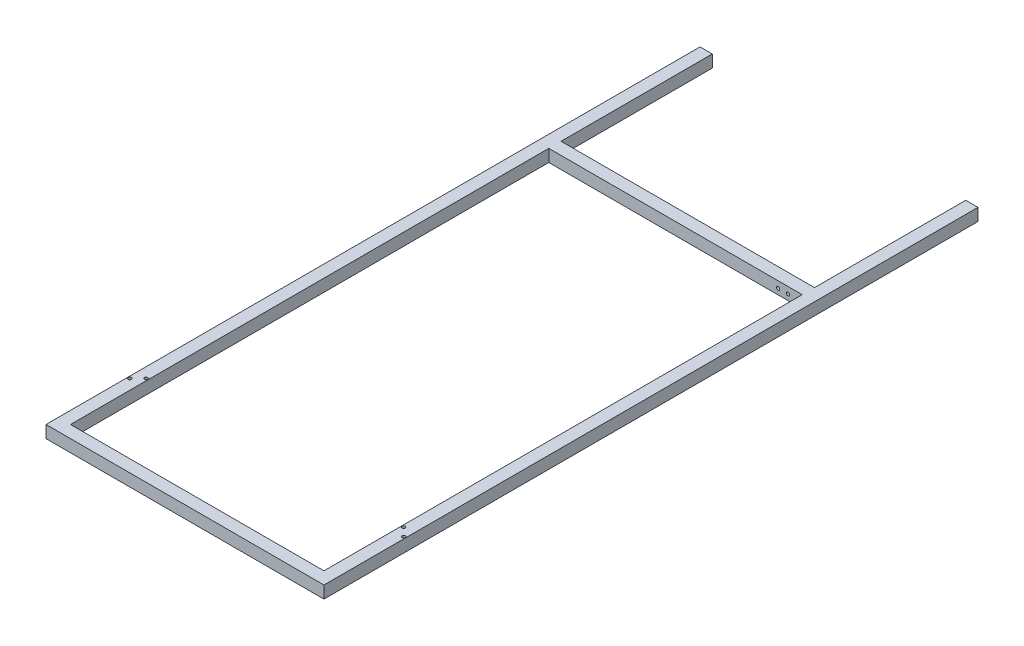
ISO-10303-21;
HEADER;
FILE_DESCRIPTION(('STEP AP214'),'2;1');
FILE_NAME('part.step','',(''),(''),'','','');
FILE_SCHEMA(('AUTOMOTIVE_DESIGN { 1 0 10303 214 1 1 1 1 }'));
ENDSEC;
DATA;
#1=APPLICATION_CONTEXT('core data for automotive mechanical design processes');
#2=APPLICATION_PROTOCOL_DEFINITION('international standard','automotive_design',2000,#1);
#3=PRODUCT_CONTEXT('',#1,'mechanical');
#4=PRODUCT('Part','Part','',(#3));
#5=PRODUCT_RELATED_PRODUCT_CATEGORY('part','',(#4));
#6=PRODUCT_DEFINITION_FORMATION('','',#4);
#7=PRODUCT_DEFINITION_CONTEXT('part definition',#1,'design');
#8=PRODUCT_DEFINITION('design','',#6,#7);
#9=PRODUCT_DEFINITION_SHAPE('','',#8);
#10=(LENGTH_UNIT() NAMED_UNIT(*) SI_UNIT(.MILLI.,.METRE.));
#11=(NAMED_UNIT(*) PLANE_ANGLE_UNIT() SI_UNIT($,.RADIAN.));
#12=(NAMED_UNIT(*) SI_UNIT($,.STERADIAN.) SOLID_ANGLE_UNIT());
#13=UNCERTAINTY_MEASURE_WITH_UNIT(LENGTH_MEASURE(1.E-05),#10,'distance_accuracy_value','');
#14=(GEOMETRIC_REPRESENTATION_CONTEXT(3) GLOBAL_UNCERTAINTY_ASSIGNED_CONTEXT((#13)) GLOBAL_UNIT_ASSIGNED_CONTEXT((#10,
#11,#12)) REPRESENTATION_CONTEXT('',''));
#15=CARTESIAN_POINT('',(0.,0.,0.));
#16=DIRECTION('',(0.,0.,1.));
#17=DIRECTION('',(1.,0.,0.));
#18=AXIS2_PLACEMENT_3D('',#15,#16,#17);
#19=CARTESIAN_POINT('',(157.642487046632,0.,785.));
#20=DIRECTION('',(1.,0.,0.));
#21=DIRECTION('',(0.,0.,-1.));
#22=AXIS2_PLACEMENT_3D('',#19,#20,#21);
#23=PLANE('',#22);
#24=DIRECTION('',(0.,0.,-1.));
#25=VECTOR('',#24,1.);
#26=CARTESIAN_POINT('',(157.642487046632,0.,785.));
#27=LINE('',#26,#25);
#28=CARTESIAN_POINT('',(157.642487046632,0.,185.));
#29=VERTEX_POINT('',#28);
#30=CARTESIAN_POINT('',(157.642487046632,0.,0.));
#31=VERTEX_POINT('',#30);
#32=EDGE_CURVE('E55',#29,#31,#27,.T.);
#33=ORIENTED_EDGE('',*,*,#32,.F.);
#34=DIRECTION('',(0.,1.,0.));
#35=VECTOR('',#34,1.);
#36=CARTESIAN_POINT('',(157.642487046632,0.,185.));
#37=LINE('',#36,#35);
#38=CARTESIAN_POINT('',(157.642487046632,15.,185.));
#39=VERTEX_POINT('',#38);
#40=EDGE_CURVE('E175',#29,#39,#37,.T.);
#41=ORIENTED_EDGE('',*,*,#40,.T.);
#42=DIRECTION('',(0.,0.,-1.));
#43=VECTOR('',#42,1.);
#44=CARTESIAN_POINT('',(157.642487046632,15.,785.));
#45=LINE('',#44,#43);
#46=CARTESIAN_POINT('',(157.642487046632,15.,0.));
#47=VERTEX_POINT('',#46);
#48=EDGE_CURVE('E195',#39,#47,#45,.T.);
#49=ORIENTED_EDGE('',*,*,#48,.T.);
#50=DIRECTION('',(0.,1.,0.));
#51=VECTOR('',#50,1.);
#52=CARTESIAN_POINT('',(157.642487046632,0.,0.));
#53=LINE('',#52,#51);
#54=EDGE_CURVE('E199',#31,#47,#53,.T.);
#55=ORIENTED_EDGE('',*,*,#54,.F.);
#56=EDGE_LOOP('',(#33,#41,#49,#55));
#57=FACE_BOUND('',#56,.T.);
#58=ADVANCED_FACE('F39',(#57),#23,.F.);
#59=CARTESIAN_POINT('',(-152.357512953368,0.,0.));
#60=DIRECTION('',(-1.,0.,0.));
#61=DIRECTION('',(0.,0.,1.));
#62=AXIS2_PLACEMENT_3D('',#59,#60,#61);
#63=PLANE('',#62);
#64=DIRECTION('',(0.,0.,1.));
#65=VECTOR('',#64,1.);
#66=CARTESIAN_POINT('',(-152.357512953368,15.,0.));
#67=LINE('',#66,#65);
#68=CARTESIAN_POINT('',(-152.357512953368,15.,0.));
#69=VERTEX_POINT('',#68);
#70=CARTESIAN_POINT('',(-152.357512953368,15.,185.));
#71=VERTEX_POINT('',#70);
#72=EDGE_CURVE('E143',#69,#71,#67,.T.);
#73=ORIENTED_EDGE('',*,*,#72,.T.);
#74=DIRECTION('',(0.,1.,0.));
#75=VECTOR('',#74,1.);
#76=CARTESIAN_POINT('',(-152.357512953368,0.,185.));
#77=LINE('',#76,#75);
#78=CARTESIAN_POINT('',(-152.357512953368,0.,185.));
#79=VERTEX_POINT('',#78);
#80=EDGE_CURVE('E144',#79,#71,#77,.T.);
#81=ORIENTED_EDGE('',*,*,#80,.F.);
#82=DIRECTION('',(0.,0.,1.));
#83=VECTOR('',#82,1.);
#84=CARTESIAN_POINT('',(-152.357512953368,0.,0.));
#85=LINE('',#84,#83);
#86=CARTESIAN_POINT('',(-152.357512953368,0.,0.));
#87=VERTEX_POINT('',#86);
#88=EDGE_CURVE('E180',#87,#79,#85,.T.);
#89=ORIENTED_EDGE('',*,*,#88,.F.);
#90=DIRECTION('',(0.,1.,0.));
#91=VECTOR('',#90,1.);
#92=CARTESIAN_POINT('',(-152.357512953368,0.,0.));
#93=LINE('',#92,#91);
#94=EDGE_CURVE('E190',#87,#69,#93,.T.);
#95=ORIENTED_EDGE('',*,*,#94,.T.);
#96=EDGE_LOOP('',(#73,#81,#89,#95));
#97=FACE_BOUND('',#96,.T.);
#98=ADVANCED_FACE('F365',(#97),#63,.F.);
#99=CARTESIAN_POINT('',(-167.357512953368,15.,0.));
#100=DIRECTION('',(0.,0.,1.));
#101=DIRECTION('',(1.,0.,0.));
#102=AXIS2_PLACEMENT_3D('',#99,#100,#101);
#103=PLANE('',#102);
#104=DIRECTION('',(-1.,0.,0.));
#105=VECTOR('',#104,1.);
#106=CARTESIAN_POINT('',(-167.357512953368,0.,0.));
#107=LINE('',#106,#105);
#108=CARTESIAN_POINT('',(172.642487046632,0.,0.));
#109=VERTEX_POINT('',#108);
#110=EDGE_CURVE('E217',#109,#31,#107,.T.);
#111=ORIENTED_EDGE('',*,*,#110,.T.);
#112=ORIENTED_EDGE('',*,*,#54,.T.);
#113=DIRECTION('',(-1.,0.,0.));
#114=VECTOR('',#113,1.);
#115=CARTESIAN_POINT('',(-167.357512953368,15.,0.));
#116=LINE('',#115,#114);
#117=CARTESIAN_POINT('',(172.642487046632,15.,0.));
#118=VERTEX_POINT('',#117);
#119=EDGE_CURVE('E224',#118,#47,#116,.T.);
#120=ORIENTED_EDGE('',*,*,#119,.F.);
#121=DIRECTION('',(0.,-1.,0.));
#122=VECTOR('',#121,1.);
#123=CARTESIAN_POINT('',(172.642487046632,15.,0.));
#124=LINE('',#123,#122);
#125=EDGE_CURVE('E245',#118,#109,#124,.T.);
#126=ORIENTED_EDGE('',*,*,#125,.T.);
#127=EDGE_LOOP('',(#111,#112,#120,#126));
#128=FACE_BOUND('',#127,.T.);
#129=ADVANCED_FACE('F264',(#128),#103,.F.);
#130=CARTESIAN_POINT('',(-167.357512953368,15.,0.));
#131=DIRECTION('',(1.,0.,0.));
#132=DIRECTION('',(0.,0.,-1.));
#133=AXIS2_PLACEMENT_3D('',#130,#131,#132);
#134=PLANE('',#133);
#135=DIRECTION('',(0.,0.,1.));
#136=VECTOR('',#135,1.);
#137=CARTESIAN_POINT('',(-167.357512953368,0.,0.));
#138=LINE('',#137,#136);
#139=CARTESIAN_POINT('',(-167.357512953368,0.,0.));
#140=VERTEX_POINT('',#139);
#141=CARTESIAN_POINT('',(-167.357512953368,0.,800.));
#142=VERTEX_POINT('',#141);
#143=EDGE_CURVE('E203',#140,#142,#138,.T.);
#144=ORIENTED_EDGE('',*,*,#143,.T.);
#145=DIRECTION('',(0.,-1.,0.));
#146=VECTOR('',#145,1.);
#147=CARTESIAN_POINT('',(-167.357512953368,15.,800.));
#148=LINE('',#147,#146);
#149=CARTESIAN_POINT('',(-167.357512953368,15.,800.));
#150=VERTEX_POINT('',#149);
#151=EDGE_CURVE('E11',#150,#142,#148,.T.);
#152=ORIENTED_EDGE('',*,*,#151,.F.);
#153=DIRECTION('',(0.,0.,1.));
#154=VECTOR('',#153,1.);
#155=CARTESIAN_POINT('',(-167.357512953368,15.,0.));
#156=LINE('',#155,#154);
#157=CARTESIAN_POINT('',(-167.357512953368,15.,0.));
#158=VERTEX_POINT('',#157);
#159=EDGE_CURVE('E212',#158,#150,#156,.T.);
#160=ORIENTED_EDGE('',*,*,#159,.F.);
#161=DIRECTION('',(0.,-1.,0.));
#162=VECTOR('',#161,1.);
#163=CARTESIAN_POINT('',(-167.357512953368,15.,0.));
#164=LINE('',#163,#162);
#165=EDGE_CURVE('E228',#158,#140,#164,.T.);
#166=ORIENTED_EDGE('',*,*,#165,.T.);
#167=EDGE_LOOP('',(#144,#152,#160,#166));
#168=FACE_BOUND('',#167,.T.);
#169=ADVANCED_FACE('F41',(#168),#134,.F.);
#170=CARTESIAN_POINT('',(-167.357512953368,15.,800.));
#171=DIRECTION('',(0.,0.,-1.));
#172=DIRECTION('',(-1.,0.,0.));
#173=AXIS2_PLACEMENT_3D('',#170,#171,#172);
#174=PLANE('',#173);
#175=DIRECTION('',(1.,0.,0.));
#176=VECTOR('',#175,1.);
#177=CARTESIAN_POINT('',(-167.357512953368,0.,800.));
#178=LINE('',#177,#176);
#179=CARTESIAN_POINT('',(172.642487046632,0.,800.));
#180=VERTEX_POINT('',#179);
#181=EDGE_CURVE('E232',#142,#180,#178,.T.);
#182=ORIENTED_EDGE('',*,*,#181,.T.);
#183=DIRECTION('',(0.,-1.,0.));
#184=VECTOR('',#183,1.);
#185=CARTESIAN_POINT('',(172.642487046632,15.,800.));
#186=LINE('',#185,#184);
#187=CARTESIAN_POINT('',(172.642487046632,15.,800.));
#188=VERTEX_POINT('',#187);
#189=EDGE_CURVE('E48',#188,#180,#186,.T.);
#190=ORIENTED_EDGE('',*,*,#189,.F.);
#191=DIRECTION('',(1.,0.,0.));
#192=VECTOR('',#191,1.);
#193=CARTESIAN_POINT('',(-167.357512953368,15.,800.));
#194=LINE('',#193,#192);
#195=EDGE_CURVE('E216',#150,#188,#194,.T.);
#196=ORIENTED_EDGE('',*,*,#195,.F.);
#197=ORIENTED_EDGE('',*,*,#151,.T.);
#198=EDGE_LOOP('',(#182,#190,#196,#197));
#199=FACE_BOUND('',#198,.T.);
#200=ADVANCED_FACE('F269',(#199),#174,.F.);
#201=CARTESIAN_POINT('',(172.642487046632,15.,0.));
#202=DIRECTION('',(-1.,0.,0.));
#203=DIRECTION('',(0.,0.,1.));
#204=AXIS2_PLACEMENT_3D('',#201,#202,#203);
#205=PLANE('',#204);
#206=DIRECTION('',(0.,0.,-1.));
#207=VECTOR('',#206,1.);
#208=CARTESIAN_POINT('',(172.642487046632,0.,0.));
#209=LINE('',#208,#207);
#210=EDGE_CURVE('E235',#180,#109,#209,.T.);
#211=ORIENTED_EDGE('',*,*,#210,.T.);
#212=ORIENTED_EDGE('',*,*,#125,.F.);
#213=DIRECTION('',(0.,0.,-1.));
#214=VECTOR('',#213,1.);
#215=CARTESIAN_POINT('',(172.642487046632,15.,0.));
#216=LINE('',#215,#214);
#217=EDGE_CURVE('E220',#188,#118,#216,.T.);
#218=ORIENTED_EDGE('',*,*,#217,.F.);
#219=ORIENTED_EDGE('',*,*,#189,.T.);
#220=EDGE_LOOP('',(#211,#212,#218,#219));
#221=FACE_BOUND('',#220,.T.);
#222=ADVANCED_FACE('F254',(#221),#205,.F.);
#223=EDGE_CURVE('E223',#69,#158,#116,.T.);
#224=ORIENTED_EDGE('',*,*,#223,.F.);
#225=ORIENTED_EDGE('',*,*,#94,.F.);
#226=EDGE_CURVE('E238',#87,#140,#107,.T.);
#227=ORIENTED_EDGE('',*,*,#226,.T.);
#228=ORIENTED_EDGE('',*,*,#165,.F.);
#229=EDGE_LOOP('',(#224,#225,#227,#228));
#230=FACE_BOUND('',#229,.T.);
#231=ADVANCED_FACE('F347',(#230),#103,.F.);
#232=CARTESIAN_POINT('',(0.,15.,0.));
#233=DIRECTION('',(0.,1.,0.));
#234=DIRECTION('',(0.,0.,1.));
#235=AXIS2_PLACEMENT_3D('',#232,#233,#234);
#236=PLANE('',#235);
#237=CARTESIAN_POINT('',(-154.857512953368,15.,690.));
#238=DIRECTION('',(0.,1.,0.));
#239=DIRECTION('',(0.,0.,1.));
#240=AXIS2_PLACEMENT_3D('',#237,#238,#239);
#241=CIRCLE('',#240,2.);
#242=CARTESIAN_POINT('',(-154.857512953368,15.,692.));
#243=VERTEX_POINT('',#242);
#244=EDGE_CURVE('E311',#243,#243,#241,.T.);
#245=ORIENTED_EDGE('',*,*,#244,.F.);
#246=EDGE_LOOP('',(#245));
#247=FACE_BOUND('',#246,.T.);
#248=CARTESIAN_POINT('',(-164.857512953368,15.,700.));
#249=DIRECTION('',(0.,1.,0.));
#250=DIRECTION('',(0.,0.,1.));
#251=AXIS2_PLACEMENT_3D('',#248,#249,#250);
#252=CIRCLE('',#251,2.);
#253=CARTESIAN_POINT('',(-164.857512953368,15.,702.));
#254=VERTEX_POINT('',#253);
#255=EDGE_CURVE('E319',#254,#254,#252,.T.);
#256=ORIENTED_EDGE('',*,*,#255,.F.);
#257=EDGE_LOOP('',(#256));
#258=FACE_BOUND('',#257,.T.);
#259=CARTESIAN_POINT('',(170.142487046632,15.,700.));
#260=DIRECTION('',(0.,1.,0.));
#261=DIRECTION('',(0.,0.,1.));
#262=AXIS2_PLACEMENT_3D('',#259,#260,#261);
#263=CIRCLE('',#262,2.);
#264=CARTESIAN_POINT('',(170.142487046632,15.,702.));
#265=VERTEX_POINT('',#264);
#266=EDGE_CURVE('E327',#265,#265,#263,.T.);
#267=ORIENTED_EDGE('',*,*,#266,.F.);
#268=EDGE_LOOP('',(#267));
#269=FACE_BOUND('',#268,.T.);
#270=CARTESIAN_POINT('',(160.142487046632,15.,690.));
#271=DIRECTION('',(0.,1.,0.));
#272=DIRECTION('',(0.,0.,1.));
#273=AXIS2_PLACEMENT_3D('',#270,#271,#272);
#274=CIRCLE('',#273,2.);
#275=CARTESIAN_POINT('',(160.142487046632,15.,692.));
#276=VERTEX_POINT('',#275);
#277=EDGE_CURVE('E303',#276,#276,#274,.T.);
#278=ORIENTED_EDGE('',*,*,#277,.F.);
#279=EDGE_LOOP('',(#278));
#280=FACE_BOUND('',#279,.T.);
#281=ORIENTED_EDGE('',*,*,#48,.F.);
#282=DIRECTION('',(-1.,0.,0.));
#283=VECTOR('',#282,1.);
#284=CARTESIAN_POINT('',(-152.357512953368,15.,185.));
#285=LINE('',#284,#283);
#286=EDGE_CURVE('E158',#39,#71,#285,.T.);
#287=ORIENTED_EDGE('',*,*,#286,.T.);
#288=ORIENTED_EDGE('',*,*,#72,.F.);
#289=ORIENTED_EDGE('',*,*,#223,.T.);
#290=ORIENTED_EDGE('',*,*,#159,.T.);
#291=ORIENTED_EDGE('',*,*,#195,.T.);
#292=ORIENTED_EDGE('',*,*,#217,.T.);
#293=ORIENTED_EDGE('',*,*,#119,.T.);
#294=EDGE_LOOP('',(#281,#287,#288,#289,#290,#291,#292,#293));
#295=FACE_BOUND('',#294,.T.);
#296=CARTESIAN_POINT('',(157.642487046632,15.,785.));
#297=VERTEX_POINT('',#296);
#298=CARTESIAN_POINT('',(157.642487046632,15.,200.));
#299=VERTEX_POINT('',#298);
#300=EDGE_CURVE('E196',#297,#299,#45,.T.);
#301=ORIENTED_EDGE('',*,*,#300,.F.);
#302=DIRECTION('',(1.,0.,0.));
#303=VECTOR('',#302,1.);
#304=CARTESIAN_POINT('',(-152.357512953368,15.,785.));
#305=LINE('',#304,#303);
#306=CARTESIAN_POINT('',(-152.357512953368,15.,785.));
#307=VERTEX_POINT('',#306);
#308=EDGE_CURVE('E138',#307,#297,#305,.T.);
#309=ORIENTED_EDGE('',*,*,#308,.F.);
#310=CARTESIAN_POINT('',(-152.357512953368,15.,200.));
#311=VERTEX_POINT('',#310);
#312=EDGE_CURVE('E131',#311,#307,#67,.T.);
#313=ORIENTED_EDGE('',*,*,#312,.F.);
#314=DIRECTION('',(1.,0.,0.));
#315=VECTOR('',#314,1.);
#316=CARTESIAN_POINT('',(157.642487046632,15.,200.));
#317=LINE('',#316,#315);
#318=EDGE_CURVE('E136',#311,#299,#317,.T.);
#319=ORIENTED_EDGE('',*,*,#318,.T.);
#320=EDGE_LOOP('',(#301,#309,#313,#319));
#321=FACE_BOUND('',#320,.T.);
#322=ADVANCED_FACE('F134',(#247,#258,#269,#280,#295,#321),#236,.T.);
#323=CARTESIAN_POINT('',(0.,0.,0.));
#324=DIRECTION('',(0.,1.,0.));
#325=DIRECTION('',(0.,0.,1.));
#326=AXIS2_PLACEMENT_3D('',#323,#324,#325);
#327=PLANE('',#326);
#328=CARTESIAN_POINT('',(-154.857512953368,0.,690.));
#329=DIRECTION('',(0.,1.,0.));
#330=DIRECTION('',(0.,0.,1.));
#331=AXIS2_PLACEMENT_3D('',#328,#329,#330);
#332=CIRCLE('',#331,2.);
#333=CARTESIAN_POINT('',(-154.857512953368,0.,692.));
#334=VERTEX_POINT('',#333);
#335=EDGE_CURVE('E315',#334,#334,#332,.T.);
#336=ORIENTED_EDGE('',*,*,#335,.T.);
#337=EDGE_LOOP('',(#336));
#338=FACE_BOUND('',#337,.T.);
#339=CARTESIAN_POINT('',(-164.857512953368,0.,700.));
#340=DIRECTION('',(0.,1.,0.));
#341=DIRECTION('',(0.,0.,1.));
#342=AXIS2_PLACEMENT_3D('',#339,#340,#341);
#343=CIRCLE('',#342,2.);
#344=CARTESIAN_POINT('',(-164.857512953368,0.,702.));
#345=VERTEX_POINT('',#344);
#346=EDGE_CURVE('E323',#345,#345,#343,.T.);
#347=ORIENTED_EDGE('',*,*,#346,.T.);
#348=EDGE_LOOP('',(#347));
#349=FACE_BOUND('',#348,.T.);
#350=CARTESIAN_POINT('',(170.142487046632,0.,700.));
#351=DIRECTION('',(0.,1.,0.));
#352=DIRECTION('',(0.,0.,1.));
#353=AXIS2_PLACEMENT_3D('',#350,#351,#352);
#354=CIRCLE('',#353,2.);
#355=CARTESIAN_POINT('',(170.142487046632,0.,702.));
#356=VERTEX_POINT('',#355);
#357=EDGE_CURVE('E307',#356,#356,#354,.T.);
#358=ORIENTED_EDGE('',*,*,#357,.T.);
#359=EDGE_LOOP('',(#358));
#360=FACE_BOUND('',#359,.T.);
#361=CARTESIAN_POINT('',(160.142487046632,0.,690.));
#362=DIRECTION('',(0.,1.,0.));
#363=DIRECTION('',(0.,0.,1.));
#364=AXIS2_PLACEMENT_3D('',#361,#362,#363);
#365=CIRCLE('',#364,2.);
#366=CARTESIAN_POINT('',(160.142487046632,0.,692.));
#367=VERTEX_POINT('',#366);
#368=EDGE_CURVE('E288',#367,#367,#365,.T.);
#369=ORIENTED_EDGE('',*,*,#368,.T.);
#370=EDGE_LOOP('',(#369));
#371=FACE_BOUND('',#370,.T.);
#372=DIRECTION('',(-1.,0.,0.));
#373=VECTOR('',#372,1.);
#374=CARTESIAN_POINT('',(-152.357512953368,0.,185.));
#375=LINE('',#374,#373);
#376=EDGE_CURVE('E154',#29,#79,#375,.T.);
#377=ORIENTED_EDGE('',*,*,#376,.F.);
#378=ORIENTED_EDGE('',*,*,#32,.T.);
#379=ORIENTED_EDGE('',*,*,#110,.F.);
#380=ORIENTED_EDGE('',*,*,#210,.F.);
#381=ORIENTED_EDGE('',*,*,#181,.F.);
#382=ORIENTED_EDGE('',*,*,#143,.F.);
#383=ORIENTED_EDGE('',*,*,#226,.F.);
#384=ORIENTED_EDGE('',*,*,#88,.T.);
#385=EDGE_LOOP('',(#377,#378,#379,#380,#381,#382,#383,#384));
#386=FACE_BOUND('',#385,.T.);
#387=DIRECTION('',(1.,0.,0.));
#388=VECTOR('',#387,1.);
#389=CARTESIAN_POINT('',(-152.357512953368,0.,785.));
#390=LINE('',#389,#388);
#391=CARTESIAN_POINT('',(-152.357512953368,0.,785.));
#392=VERTEX_POINT('',#391);
#393=CARTESIAN_POINT('',(157.642487046632,0.,785.));
#394=VERTEX_POINT('',#393);
#395=EDGE_CURVE('E184',#392,#394,#390,.T.);
#396=ORIENTED_EDGE('',*,*,#395,.T.);
#397=CARTESIAN_POINT('',(157.642487046632,0.,200.));
#398=VERTEX_POINT('',#397);
#399=EDGE_CURVE('E188',#394,#398,#27,.T.);
#400=ORIENTED_EDGE('',*,*,#399,.T.);
#401=DIRECTION('',(1.,0.,0.));
#402=VECTOR('',#401,1.);
#403=CARTESIAN_POINT('',(157.642487046632,0.,200.));
#404=LINE('',#403,#402);
#405=CARTESIAN_POINT('',(-152.357512953368,0.,200.));
#406=VERTEX_POINT('',#405);
#407=EDGE_CURVE('E164',#406,#398,#404,.T.);
#408=ORIENTED_EDGE('',*,*,#407,.F.);
#409=EDGE_CURVE('E149',#406,#392,#85,.T.);
#410=ORIENTED_EDGE('',*,*,#409,.T.);
#411=EDGE_LOOP('',(#396,#400,#408,#410));
#412=FACE_BOUND('',#411,.T.);
#413=ADVANCED_FACE('F260',(#338,#349,#360,#371,#386,#412),#327,.F.);
#414=ORIENTED_EDGE('',*,*,#300,.T.);
#415=DIRECTION('',(0.,1.,0.));
#416=VECTOR('',#415,1.);
#417=CARTESIAN_POINT('',(157.642487046632,0.,200.));
#418=LINE('',#417,#416);
#419=EDGE_CURVE('E63',#398,#299,#418,.T.);
#420=ORIENTED_EDGE('',*,*,#419,.F.);
#421=ORIENTED_EDGE('',*,*,#399,.F.);
#422=DIRECTION('',(0.,1.,0.));
#423=VECTOR('',#422,1.);
#424=CARTESIAN_POINT('',(157.642487046632,0.,785.));
#425=LINE('',#424,#423);
#426=EDGE_CURVE('E204',#394,#297,#425,.T.);
#427=ORIENTED_EDGE('',*,*,#426,.T.);
#428=EDGE_LOOP('',(#414,#420,#421,#427));
#429=FACE_BOUND('',#428,.T.);
#430=ADVANCED_FACE('F367',(#429),#23,.F.);
#431=CARTESIAN_POINT('',(-152.357512953368,0.,785.));
#432=DIRECTION('',(0.,0.,1.));
#433=DIRECTION('',(1.,0.,0.));
#434=AXIS2_PLACEMENT_3D('',#431,#432,#433);
#435=PLANE('',#434);
#436=ORIENTED_EDGE('',*,*,#308,.T.);
#437=ORIENTED_EDGE('',*,*,#426,.F.);
#438=ORIENTED_EDGE('',*,*,#395,.F.);
#439=DIRECTION('',(0.,1.,0.));
#440=VECTOR('',#439,1.);
#441=CARTESIAN_POINT('',(-152.357512953368,0.,785.));
#442=LINE('',#441,#440);
#443=EDGE_CURVE('E207',#392,#307,#442,.T.);
#444=ORIENTED_EDGE('',*,*,#443,.T.);
#445=EDGE_LOOP('',(#436,#437,#438,#444));
#446=FACE_BOUND('',#445,.T.);
#447=ADVANCED_FACE('F376',(#446),#435,.F.);
#448=ORIENTED_EDGE('',*,*,#409,.F.);
#449=DIRECTION('',(0.,1.,0.));
#450=VECTOR('',#449,1.);
#451=CARTESIAN_POINT('',(-152.357512953368,0.,200.));
#452=LINE('',#451,#450);
#453=EDGE_CURVE('E147',#406,#311,#452,.T.);
#454=ORIENTED_EDGE('',*,*,#453,.T.);
#455=ORIENTED_EDGE('',*,*,#312,.T.);
#456=ORIENTED_EDGE('',*,*,#443,.F.);
#457=EDGE_LOOP('',(#448,#454,#455,#456));
#458=FACE_BOUND('',#457,.T.);
#459=ADVANCED_FACE('F148',(#458),#63,.F.);
#460=CARTESIAN_POINT('',(-152.357512953368,0.,185.));
#461=DIRECTION('',(0.,0.,-1.));
#462=DIRECTION('',(-1.,0.,0.));
#463=AXIS2_PLACEMENT_3D('',#460,#461,#462);
#464=PLANE('',#463);
#465=CARTESIAN_POINT('',(152.142487046632,7.,185.));
#466=DIRECTION('',(0.,0.,-1.));
#467=DIRECTION('',(-1.,0.,0.));
#468=AXIS2_PLACEMENT_3D('',#465,#466,#467);
#469=CIRCLE('',#468,2.);
#470=CARTESIAN_POINT('',(150.142487046632,7.,185.));
#471=VERTEX_POINT('',#470);
#472=EDGE_CURVE('E167',#471,#471,#469,.T.);
#473=ORIENTED_EDGE('',*,*,#472,.F.);
#474=EDGE_LOOP('',(#473));
#475=FACE_BOUND('',#474,.T.);
#476=CARTESIAN_POINT('',(140.142487046632,7.,185.));
#477=DIRECTION('',(0.,0.,-1.));
#478=DIRECTION('',(-1.,0.,0.));
#479=AXIS2_PLACEMENT_3D('',#476,#477,#478);
#480=CIRCLE('',#479,2.);
#481=CARTESIAN_POINT('',(138.142487046632,7.,185.));
#482=VERTEX_POINT('',#481);
#483=EDGE_CURVE('E292',#482,#482,#480,.T.);
#484=ORIENTED_EDGE('',*,*,#483,.F.);
#485=EDGE_LOOP('',(#484));
#486=FACE_BOUND('',#485,.T.);
#487=CARTESIAN_POINT('',(128.142487046632,7.,185.));
#488=DIRECTION('',(0.,0.,-1.));
#489=DIRECTION('',(-1.,0.,0.));
#490=AXIS2_PLACEMENT_3D('',#487,#488,#489);
#491=CIRCLE('',#490,2.);
#492=CARTESIAN_POINT('',(126.142487046632,7.,185.));
#493=VERTEX_POINT('',#492);
#494=EDGE_CURVE('E283',#493,#493,#491,.T.);
#495=ORIENTED_EDGE('',*,*,#494,.F.);
#496=EDGE_LOOP('',(#495));
#497=FACE_BOUND('',#496,.T.);
#498=ORIENTED_EDGE('',*,*,#286,.F.);
#499=ORIENTED_EDGE('',*,*,#40,.F.);
#500=ORIENTED_EDGE('',*,*,#376,.T.);
#501=ORIENTED_EDGE('',*,*,#80,.T.);
#502=EDGE_LOOP('',(#498,#499,#500,#501));
#503=FACE_BOUND('',#502,.T.);
#504=ADVANCED_FACE('F424',(#475,#486,#497,#503),#464,.T.);
#505=CARTESIAN_POINT('',(157.642487046632,0.,200.));
#506=DIRECTION('',(0.,0.,1.));
#507=DIRECTION('',(1.,0.,0.));
#508=AXIS2_PLACEMENT_3D('',#505,#506,#507);
#509=PLANE('',#508);
#510=CARTESIAN_POINT('',(152.142487046632,7.,200.));
#511=DIRECTION('',(0.,0.,1.));
#512=DIRECTION('',(1.,0.,0.));
#513=AXIS2_PLACEMENT_3D('',#510,#511,#512);
#514=CIRCLE('',#513,2.);
#515=CARTESIAN_POINT('',(154.142487046632,7.,200.));
#516=VERTEX_POINT('',#515);
#517=EDGE_CURVE('E159',#516,#516,#514,.F.);
#518=ORIENTED_EDGE('',*,*,#517,.T.);
#519=EDGE_LOOP('',(#518));
#520=FACE_BOUND('',#519,.T.);
#521=CARTESIAN_POINT('',(140.142487046632,7.,200.));
#522=DIRECTION('',(0.,0.,1.));
#523=DIRECTION('',(1.,0.,0.));
#524=AXIS2_PLACEMENT_3D('',#521,#522,#523);
#525=CIRCLE('',#524,2.);
#526=CARTESIAN_POINT('',(142.142487046632,7.,200.));
#527=VERTEX_POINT('',#526);
#528=EDGE_CURVE('E296',#527,#527,#525,.F.);
#529=ORIENTED_EDGE('',*,*,#528,.T.);
#530=EDGE_LOOP('',(#529));
#531=FACE_BOUND('',#530,.T.);
#532=CARTESIAN_POINT('',(128.142487046632,7.,200.));
#533=DIRECTION('',(0.,0.,1.));
#534=DIRECTION('',(1.,0.,0.));
#535=AXIS2_PLACEMENT_3D('',#532,#533,#534);
#536=CIRCLE('',#535,2.);
#537=CARTESIAN_POINT('',(130.142487046632,7.,200.));
#538=VERTEX_POINT('',#537);
#539=EDGE_CURVE('E287',#538,#538,#536,.F.);
#540=ORIENTED_EDGE('',*,*,#539,.T.);
#541=EDGE_LOOP('',(#540));
#542=FACE_BOUND('',#541,.T.);
#543=ORIENTED_EDGE('',*,*,#318,.F.);
#544=ORIENTED_EDGE('',*,*,#453,.F.);
#545=ORIENTED_EDGE('',*,*,#407,.T.);
#546=ORIENTED_EDGE('',*,*,#419,.T.);
#547=EDGE_LOOP('',(#543,#544,#545,#546));
#548=FACE_BOUND('',#547,.T.);
#549=ADVANCED_FACE('F156',(#520,#531,#542,#548),#509,.T.);
#550=CARTESIAN_POINT('',(128.142487046632,7.,800.001));
#551=DIRECTION('',(0.,0.,-1.));
#552=DIRECTION('',(-1.,0.,0.));
#553=AXIS2_PLACEMENT_3D('',#550,#551,#552);
#554=CYLINDRICAL_SURFACE('',#553,2.);
#555=ORIENTED_EDGE('',*,*,#539,.F.);
#556=EDGE_LOOP('',(#555));
#557=FACE_BOUND('',#556,.T.);
#558=ORIENTED_EDGE('',*,*,#494,.T.);
#559=EDGE_LOOP('',(#558));
#560=FACE_BOUND('',#559,.T.);
#561=ADVANCED_FACE('F442',(#557,#560),#554,.F.);
#562=CARTESIAN_POINT('',(140.142487046632,7.,800.001));
#563=DIRECTION('',(0.,0.,-1.));
#564=DIRECTION('',(-1.,0.,0.));
#565=AXIS2_PLACEMENT_3D('',#562,#563,#564);
#566=CYLINDRICAL_SURFACE('',#565,2.);
#567=ORIENTED_EDGE('',*,*,#528,.F.);
#568=EDGE_LOOP('',(#567));
#569=FACE_BOUND('',#568,.T.);
#570=ORIENTED_EDGE('',*,*,#483,.T.);
#571=EDGE_LOOP('',(#570));
#572=FACE_BOUND('',#571,.T.);
#573=ADVANCED_FACE('F359',(#569,#572),#566,.F.);
#574=CARTESIAN_POINT('',(152.142487046632,7.,800.001));
#575=DIRECTION('',(0.,0.,-1.));
#576=DIRECTION('',(-1.,0.,0.));
#577=AXIS2_PLACEMENT_3D('',#574,#575,#576);
#578=CYLINDRICAL_SURFACE('',#577,2.);
#579=ORIENTED_EDGE('',*,*,#517,.F.);
#580=EDGE_LOOP('',(#579));
#581=FACE_BOUND('',#580,.T.);
#582=ORIENTED_EDGE('',*,*,#472,.T.);
#583=EDGE_LOOP('',(#582));
#584=FACE_BOUND('',#583,.T.);
#585=ADVANCED_FACE('F353',(#581,#584),#578,.F.);
#586=CARTESIAN_POINT('',(160.142487046632,0.,690.));
#587=DIRECTION('',(0.,1.,0.));
#588=DIRECTION('',(0.,0.,1.));
#589=AXIS2_PLACEMENT_3D('',#586,#587,#588);
#590=CYLINDRICAL_SURFACE('',#589,2.);
#591=ORIENTED_EDGE('',*,*,#368,.F.);
#592=EDGE_LOOP('',(#591));
#593=FACE_BOUND('',#592,.T.);
#594=ORIENTED_EDGE('',*,*,#277,.T.);
#595=EDGE_LOOP('',(#594));
#596=FACE_BOUND('',#595,.T.);
#597=ADVANCED_FACE('F341',(#593,#596),#590,.F.);
#598=CARTESIAN_POINT('',(170.142487046632,0.,700.));
#599=DIRECTION('',(0.,1.,0.));
#600=DIRECTION('',(0.,0.,1.));
#601=AXIS2_PLACEMENT_3D('',#598,#599,#600);
#602=CYLINDRICAL_SURFACE('',#601,2.);
#603=ORIENTED_EDGE('',*,*,#357,.F.);
#604=EDGE_LOOP('',(#603));
#605=FACE_BOUND('',#604,.T.);
#606=ORIENTED_EDGE('',*,*,#266,.T.);
#607=EDGE_LOOP('',(#606));
#608=FACE_BOUND('',#607,.T.);
#609=ADVANCED_FACE('F337',(#605,#608),#602,.F.);
#610=CARTESIAN_POINT('',(-164.857512953368,0.,700.));
#611=DIRECTION('',(0.,1.,0.));
#612=DIRECTION('',(0.,0.,1.));
#613=AXIS2_PLACEMENT_3D('',#610,#611,#612);
#614=CYLINDRICAL_SURFACE('',#613,2.);
#615=ORIENTED_EDGE('',*,*,#346,.F.);
#616=EDGE_LOOP('',(#615));
#617=FACE_BOUND('',#616,.T.);
#618=ORIENTED_EDGE('',*,*,#255,.T.);
#619=EDGE_LOOP('',(#618));
#620=FACE_BOUND('',#619,.T.);
#621=ADVANCED_FACE('F340',(#617,#620),#614,.F.);
#622=CARTESIAN_POINT('',(-154.857512953368,0.,690.));
#623=DIRECTION('',(0.,1.,0.));
#624=DIRECTION('',(0.,0.,1.));
#625=AXIS2_PLACEMENT_3D('',#622,#623,#624);
#626=CYLINDRICAL_SURFACE('',#625,2.);
#627=ORIENTED_EDGE('',*,*,#335,.F.);
#628=EDGE_LOOP('',(#627));
#629=FACE_BOUND('',#628,.T.);
#630=ORIENTED_EDGE('',*,*,#244,.T.);
#631=EDGE_LOOP('',(#630));
#632=FACE_BOUND('',#631,.T.);
#633=ADVANCED_FACE('F496',(#629,#632),#626,.F.);
#634=CLOSED_SHELL('',(#58,#98,#129,#169,#200,#222,#231,#322,#413,#430,#447,#459,#504,#549,#561,
#573,#585,#597,#609,#621,#633));
#635=MANIFOLD_SOLID_BREP('B2',#634);
#636=ADVANCED_BREP_SHAPE_REPRESENTATION('',(#18,#635),#14);
#637=SHAPE_DEFINITION_REPRESENTATION(#9,#636);
ENDSEC;
END-ISO-10303-21;
